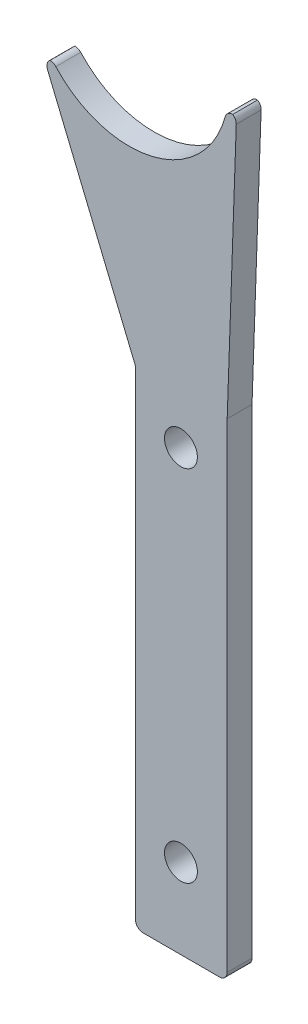
ISO-10303-21;
HEADER;
FILE_DESCRIPTION(('STEP AP214'),'2;1');
FILE_NAME('part.step','',(''),(''),'','','');
FILE_SCHEMA(('AUTOMOTIVE_DESIGN { 1 0 10303 214 1 1 1 1 }'));
ENDSEC;
DATA;
#1=APPLICATION_CONTEXT('core data for automotive mechanical design processes');
#2=APPLICATION_PROTOCOL_DEFINITION('international standard','automotive_design',2000,#1);
#3=PRODUCT_CONTEXT('',#1,'mechanical');
#4=PRODUCT('Part','Part','',(#3));
#5=PRODUCT_RELATED_PRODUCT_CATEGORY('part','',(#4));
#6=PRODUCT_DEFINITION_FORMATION('','',#4);
#7=PRODUCT_DEFINITION_CONTEXT('part definition',#1,'design');
#8=PRODUCT_DEFINITION('design','',#6,#7);
#9=PRODUCT_DEFINITION_SHAPE('','',#8);
#10=(LENGTH_UNIT() NAMED_UNIT(*) SI_UNIT(.MILLI.,.METRE.));
#11=(NAMED_UNIT(*) PLANE_ANGLE_UNIT() SI_UNIT($,.RADIAN.));
#12=(NAMED_UNIT(*) SI_UNIT($,.STERADIAN.) SOLID_ANGLE_UNIT());
#13=UNCERTAINTY_MEASURE_WITH_UNIT(LENGTH_MEASURE(1.E-05),#10,'distance_accuracy_value','');
#14=(GEOMETRIC_REPRESENTATION_CONTEXT(3) GLOBAL_UNCERTAINTY_ASSIGNED_CONTEXT((#13)) GLOBAL_UNIT_ASSIGNED_CONTEXT((#10,
#11,#12)) REPRESENTATION_CONTEXT('',''));
#15=CARTESIAN_POINT('',(0.,0.,0.));
#16=DIRECTION('',(0.,0.,1.));
#17=DIRECTION('',(1.,0.,0.));
#18=AXIS2_PLACEMENT_3D('',#15,#16,#17);
#19=CARTESIAN_POINT('',(-2.31809230427608,169.560413662932,3.175));
#20=DIRECTION('',(0.,0.,1.));
#21=DIRECTION('',(1.,0.,0.));
#22=AXIS2_PLACEMENT_3D('',#19,#20,#21);
#23=PLANE('',#22);
#24=CARTESIAN_POINT('',(4.2926,126.820276742996,3.175));
#25=DIRECTION('',(0.,0.,1.));
#26=DIRECTION('',(1.,0.,0.));
#27=AXIS2_PLACEMENT_3D('',#24,#25,#26);
#28=CIRCLE('',#27,2.1);
#29=CARTESIAN_POINT('',(6.3926,126.820276742996,3.175));
#30=VERTEX_POINT('',#29);
#31=EDGE_CURVE('E173',#30,#30,#28,.T.);
#32=ORIENTED_EDGE('',*,*,#31,.F.);
#33=EDGE_LOOP('',(#32));
#34=FACE_BOUND('',#33,.T.);
#35=CARTESIAN_POINT('',(-12.4275935947524,160.314442450676,3.175));
#36=DIRECTION('',(0.,0.,1.));
#37=DIRECTION('',(1.,0.,0.));
#38=AXIS2_PLACEMENT_3D('',#35,#36,#37);
#39=CIRCLE('',#38,1.);
#40=CARTESIAN_POINT('',(-11.6896737925278,160.98933086033,3.175));
#41=VERTEX_POINT('',#40);
#42=CARTESIAN_POINT('',(-12.4275935947524,161.314442450676,3.175));
#43=VERTEX_POINT('',#42);
#44=EDGE_CURVE('E212',#41,#43,#39,.T.);
#45=ORIENTED_EDGE('',*,*,#44,.T.);
#46=CARTESIAN_POINT('',(-11.8324325455983,160.510836001243,3.175));
#47=DIRECTION('',(0.,0.,1.));
#48=DIRECTION('',(1.,0.,0.));
#49=AXIS2_PLACEMENT_3D('',#46,#47,#48);
#50=CIRCLE('',#49,1.);
#51=CARTESIAN_POINT('',(-12.7565095548716,160.128629668313,3.175));
#52=VERTEX_POINT('',#51);
#53=EDGE_CURVE('E52',#43,#52,#50,.T.);
#54=ORIENTED_EDGE('',*,*,#53,.T.);
#55=DIRECTION('',(0.382206332930912,-0.92407700927331,0.));
#56=VECTOR('',#55,1.);
#57=CARTESIAN_POINT('',(-13.2469720926704,161.314442450676,3.175));
#58=LINE('',#57,#56);
#59=CARTESIAN_POINT('',(-1.59992299072669,133.154861162605,3.175));
#60=VERTEX_POINT('',#59);
#61=EDGE_CURVE('E189',#52,#60,#58,.T.);
#62=ORIENTED_EDGE('',*,*,#61,.T.);
#63=CARTESIAN_POINT('',(-2.524,132.772654829674,3.175));
#64=DIRECTION('',(0.,0.,1.));
#65=DIRECTION('',(1.,0.,0.));
#66=AXIS2_PLACEMENT_3D('',#63,#64,#65);
#67=CIRCLE('',#66,1.);
#68=CARTESIAN_POINT('',(-1.524,132.772654829674,3.175));
#69=VERTEX_POINT('',#68);
#70=EDGE_CURVE('E253',#60,#69,#67,.F.);
#71=ORIENTED_EDGE('',*,*,#70,.T.);
#72=DIRECTION('',(0.,-1.,0.));
#73=VECTOR('',#72,1.);
#74=CARTESIAN_POINT('',(-1.524,70.7142705310452,3.175));
#75=LINE('',#74,#73);
#76=CARTESIAN_POINT('',(-1.524,71.7142705310452,3.175));
#77=VERTEX_POINT('',#76);
#78=EDGE_CURVE('E280',#69,#77,#75,.T.);
#79=ORIENTED_EDGE('',*,*,#78,.T.);
#80=CARTESIAN_POINT('',(-0.524,71.7142705310452,3.175));
#81=DIRECTION('',(0.,0.,1.));
#82=DIRECTION('',(1.,0.,0.));
#83=AXIS2_PLACEMENT_3D('',#80,#81,#82);
#84=CIRCLE('',#83,1.);
#85=CARTESIAN_POINT('',(-0.524,70.7142705310452,3.175));
#86=VERTEX_POINT('',#85);
#87=EDGE_CURVE('E218',#77,#86,#84,.T.);
#88=ORIENTED_EDGE('',*,*,#87,.T.);
#89=DIRECTION('',(1.,0.,0.));
#90=VECTOR('',#89,1.);
#91=CARTESIAN_POINT('',(7.55374445081113,70.7142705310452,3.175));
#92=LINE('',#91,#90);
#93=CARTESIAN_POINT('',(9.2026,70.7142705310452,3.175));
#94=VERTEX_POINT('',#93);
#95=EDGE_CURVE('E150',#86,#94,#92,.T.);
#96=ORIENTED_EDGE('',*,*,#95,.T.);
#97=CARTESIAN_POINT('',(9.2026,71.7142705310452,3.175));
#98=DIRECTION('',(0.,0.,1.));
#99=DIRECTION('',(1.,0.,0.));
#100=AXIS2_PLACEMENT_3D('',#97,#98,#99);
#101=CIRCLE('',#100,1.);
#102=CARTESIAN_POINT('',(10.2026,71.7142705310452,3.175));
#103=VERTEX_POINT('',#102);
#104=EDGE_CURVE('E145',#94,#103,#101,.T.);
#105=ORIENTED_EDGE('',*,*,#104,.T.);
#106=DIRECTION('',(0.,1.,0.));
#107=VECTOR('',#106,1.);
#108=CARTESIAN_POINT('',(10.2026,70.7142705310452,3.175));
#109=LINE('',#108,#107);
#110=CARTESIAN_POINT('',(10.2026,132.97129881902,3.175));
#111=VERTEX_POINT('',#110);
#112=EDGE_CURVE('E138',#103,#111,#109,.T.);
#113=ORIENTED_EDGE('',*,*,#112,.T.);
#114=DIRECTION('',(0.0349394291623043,0.999389431748111,0.));
#115=VECTOR('',#114,1.);
#116=CARTESIAN_POINT('',(11.3925030989291,167.006674049394,3.175));
#117=LINE('',#116,#115);
#118=CARTESIAN_POINT('',(11.3620897321167,166.136745773375,3.175));
#119=VERTEX_POINT('',#118);
#120=EDGE_CURVE('E141',#111,#119,#117,.T.);
#121=ORIENTED_EDGE('',*,*,#120,.T.);
#122=CARTESIAN_POINT('',(10.3627003003685,166.171685202537,3.175));
#123=DIRECTION('',(0.,0.,1.));
#124=DIRECTION('',(1.,0.,0.));
#125=AXIS2_PLACEMENT_3D('',#122,#123,#124);
#126=CIRCLE('',#125,1.);
#127=CARTESIAN_POINT('',(10.9129671680102,167.006674049394,3.175));
#128=VERTEX_POINT('',#127);
#129=EDGE_CURVE('E265',#119,#128,#126,.T.);
#130=ORIENTED_EDGE('',*,*,#129,.T.);
#131=CARTESIAN_POINT('',(10.9129671680102,166.006674049394,3.175));
#132=DIRECTION('',(0.,0.,1.));
#133=DIRECTION('',(1.,0.,0.));
#134=AXIS2_PLACEMENT_3D('',#131,#132,#133);
#135=CIRCLE('',#134,1.);
#136=CARTESIAN_POINT('',(9.94719640360974,166.266071101477,3.175));
#137=VERTEX_POINT('',#136);
#138=EDGE_CURVE('E215',#128,#137,#135,.T.);
#139=ORIENTED_EDGE('',*,*,#138,.T.);
#140=CARTESIAN_POINT('',(-2.31809230427608,169.560413662932,3.175));
#141=DIRECTION('',(0.,0.,-1.));
#142=DIRECTION('',(1.,0.,0.));
#143=AXIS2_PLACEMENT_3D('',#140,#141,#142);
#144=CIRCLE('',#143,12.7);
#145=EDGE_CURVE('E159',#137,#41,#144,.T.);
#146=ORIENTED_EDGE('',*,*,#145,.T.);
#147=EDGE_LOOP('',(#45,#54,#62,#71,#79,#88,#96,#105,#113,#121,#130,#139,#146));
#148=FACE_BOUND('',#147,.T.);
#149=CARTESIAN_POINT('',(4.2926,80.9517188014306,3.175));
#150=DIRECTION('',(0.,0.,1.));
#151=DIRECTION('',(1.,0.,0.));
#152=AXIS2_PLACEMENT_3D('',#149,#150,#151);
#153=CIRCLE('',#152,2.1);
#154=CARTESIAN_POINT('',(6.3926,80.9517188014306,3.175));
#155=VERTEX_POINT('',#154);
#156=EDGE_CURVE('E458',#155,#155,#153,.T.);
#157=ORIENTED_EDGE('',*,*,#156,.F.);
#158=EDGE_LOOP('',(#157));
#159=FACE_BOUND('',#158,.T.);
#160=ADVANCED_FACE('F43',(#34,#148,#159),#23,.T.);
#161=CARTESIAN_POINT('',(-2.31809230427608,169.560413662932,0.));
#162=DIRECTION('',(0.,0.,1.));
#163=DIRECTION('',(1.,0.,0.));
#164=AXIS2_PLACEMENT_3D('',#161,#162,#163);
#165=PLANE('',#164);
#166=DIRECTION('',(0.382206332930912,-0.92407700927331,0.));
#167=VECTOR('',#166,1.);
#168=CARTESIAN_POINT('',(-13.2469720926704,161.314442450676,0.));
#169=LINE('',#168,#167);
#170=CARTESIAN_POINT('',(-12.7565095548716,160.128629668313,0.));
#171=VERTEX_POINT('',#170);
#172=CARTESIAN_POINT('',(-1.59992299072669,133.154861162605,0.));
#173=VERTEX_POINT('',#172);
#174=EDGE_CURVE('E169',#171,#173,#169,.T.);
#175=ORIENTED_EDGE('',*,*,#174,.F.);
#176=CARTESIAN_POINT('',(-11.8324325455983,160.510836001243,0.));
#177=DIRECTION('',(0.,0.,1.));
#178=DIRECTION('',(1.,0.,0.));
#179=AXIS2_PLACEMENT_3D('',#176,#177,#178);
#180=CIRCLE('',#179,1.);
#181=CARTESIAN_POINT('',(-12.4275935947524,161.314442450676,0.));
#182=VERTEX_POINT('',#181);
#183=EDGE_CURVE('E262',#171,#182,#180,.F.);
#184=ORIENTED_EDGE('',*,*,#183,.T.);
#185=CARTESIAN_POINT('',(-12.4275935947524,160.314442450676,0.));
#186=DIRECTION('',(0.,0.,1.));
#187=DIRECTION('',(1.,0.,0.));
#188=AXIS2_PLACEMENT_3D('',#185,#186,#187);
#189=CIRCLE('',#188,1.);
#190=CARTESIAN_POINT('',(-11.6896737925278,160.98933086033,0.));
#191=VERTEX_POINT('',#190);
#192=EDGE_CURVE('E193',#182,#191,#189,.F.);
#193=ORIENTED_EDGE('',*,*,#192,.T.);
#194=CARTESIAN_POINT('',(-2.31809230427608,169.560413662932,0.));
#195=DIRECTION('',(0.,0.,-1.));
#196=DIRECTION('',(1.,0.,0.));
#197=AXIS2_PLACEMENT_3D('',#194,#195,#196);
#198=CIRCLE('',#197,12.7);
#199=CARTESIAN_POINT('',(9.94719640360974,166.266071101477,0.));
#200=VERTEX_POINT('',#199);
#201=EDGE_CURVE('E186',#200,#191,#198,.T.);
#202=ORIENTED_EDGE('',*,*,#201,.F.);
#203=CARTESIAN_POINT('',(10.9129671680102,166.006674049394,0.));
#204=DIRECTION('',(0.,0.,1.));
#205=DIRECTION('',(1.,0.,0.));
#206=AXIS2_PLACEMENT_3D('',#203,#204,#205);
#207=CIRCLE('',#206,1.);
#208=CARTESIAN_POINT('',(10.9129671680102,167.006674049394,0.));
#209=VERTEX_POINT('',#208);
#210=EDGE_CURVE('E196',#200,#209,#207,.F.);
#211=ORIENTED_EDGE('',*,*,#210,.T.);
#212=CARTESIAN_POINT('',(10.3627003003685,166.171685202537,0.));
#213=DIRECTION('',(0.,0.,1.));
#214=DIRECTION('',(1.,0.,0.));
#215=AXIS2_PLACEMENT_3D('',#212,#213,#214);
#216=CIRCLE('',#215,1.);
#217=CARTESIAN_POINT('',(11.3620897321167,166.136745773375,0.));
#218=VERTEX_POINT('',#217);
#219=EDGE_CURVE('E65',#209,#218,#216,.F.);
#220=ORIENTED_EDGE('',*,*,#219,.T.);
#221=DIRECTION('',(0.0349394291623043,0.999389431748111,0.));
#222=VECTOR('',#221,1.);
#223=CARTESIAN_POINT('',(11.3925030989291,167.006674049394,0.));
#224=LINE('',#223,#222);
#225=CARTESIAN_POINT('',(10.2026,132.97129881902,0.));
#226=VERTEX_POINT('',#225);
#227=EDGE_CURVE('E183',#226,#218,#224,.T.);
#228=ORIENTED_EDGE('',*,*,#227,.F.);
#229=DIRECTION('',(0.,1.,0.));
#230=VECTOR('',#229,1.);
#231=CARTESIAN_POINT('',(10.2026,70.7142705310452,0.));
#232=LINE('',#231,#230);
#233=CARTESIAN_POINT('',(10.2026,71.7142705310452,0.));
#234=VERTEX_POINT('',#233);
#235=EDGE_CURVE('E156',#234,#226,#232,.T.);
#236=ORIENTED_EDGE('',*,*,#235,.F.);
#237=CARTESIAN_POINT('',(9.2026,71.7142705310452,0.));
#238=DIRECTION('',(0.,0.,1.));
#239=DIRECTION('',(1.,0.,0.));
#240=AXIS2_PLACEMENT_3D('',#237,#238,#239);
#241=CIRCLE('',#240,1.);
#242=CARTESIAN_POINT('',(9.2026,70.7142705310452,0.));
#243=VERTEX_POINT('',#242);
#244=EDGE_CURVE('E202',#234,#243,#241,.F.);
#245=ORIENTED_EDGE('',*,*,#244,.T.);
#246=DIRECTION('',(1.,0.,0.));
#247=VECTOR('',#246,1.);
#248=CARTESIAN_POINT('',(7.55374445081113,70.7142705310452,0.));
#249=LINE('',#248,#247);
#250=CARTESIAN_POINT('',(-0.524,70.7142705310452,0.));
#251=VERTEX_POINT('',#250);
#252=EDGE_CURVE('E177',#251,#243,#249,.T.);
#253=ORIENTED_EDGE('',*,*,#252,.F.);
#254=CARTESIAN_POINT('',(-0.524,71.7142705310452,0.));
#255=DIRECTION('',(0.,0.,1.));
#256=DIRECTION('',(1.,0.,0.));
#257=AXIS2_PLACEMENT_3D('',#254,#255,#256);
#258=CIRCLE('',#257,1.);
#259=CARTESIAN_POINT('',(-1.524,71.7142705310452,0.));
#260=VERTEX_POINT('',#259);
#261=EDGE_CURVE('E199',#251,#260,#258,.F.);
#262=ORIENTED_EDGE('',*,*,#261,.T.);
#263=DIRECTION('',(0.,-1.,0.));
#264=VECTOR('',#263,1.);
#265=CARTESIAN_POINT('',(-1.524,70.7142705310452,0.));
#266=LINE('',#265,#264);
#267=CARTESIAN_POINT('',(-1.524,132.772654829674,0.));
#268=VERTEX_POINT('',#267);
#269=EDGE_CURVE('E172',#268,#260,#266,.T.);
#270=ORIENTED_EDGE('',*,*,#269,.F.);
#271=CARTESIAN_POINT('',(-2.524,132.772654829674,0.));
#272=DIRECTION('',(0.,0.,1.));
#273=DIRECTION('',(1.,0.,0.));
#274=AXIS2_PLACEMENT_3D('',#271,#272,#273);
#275=CIRCLE('',#274,1.);
#276=EDGE_CURVE('E249',#268,#173,#275,.T.);
#277=ORIENTED_EDGE('',*,*,#276,.T.);
#278=EDGE_LOOP('',(#175,#184,#193,#202,#211,#220,#228,#236,#245,#253,#262,#270,#277));
#279=FACE_BOUND('',#278,.T.);
#280=CARTESIAN_POINT('',(4.2926,126.820276742996,0.));
#281=DIRECTION('',(0.,0.,1.));
#282=DIRECTION('',(1.,0.,0.));
#283=AXIS2_PLACEMENT_3D('',#280,#281,#282);
#284=CIRCLE('',#283,2.1);
#285=CARTESIAN_POINT('',(6.3926,126.820276742996,0.));
#286=VERTEX_POINT('',#285);
#287=EDGE_CURVE('E456',#286,#286,#284,.T.);
#288=ORIENTED_EDGE('',*,*,#287,.T.);
#289=EDGE_LOOP('',(#288));
#290=FACE_BOUND('',#289,.T.);
#291=CARTESIAN_POINT('',(4.2926,80.9517188014306,0.));
#292=DIRECTION('',(0.,0.,1.));
#293=DIRECTION('',(1.,0.,0.));
#294=AXIS2_PLACEMENT_3D('',#291,#292,#293);
#295=CIRCLE('',#294,2.1);
#296=CARTESIAN_POINT('',(6.3926,80.9517188014306,0.));
#297=VERTEX_POINT('',#296);
#298=EDGE_CURVE('E464',#297,#297,#295,.T.);
#299=ORIENTED_EDGE('',*,*,#298,.T.);
#300=EDGE_LOOP('',(#299));
#301=FACE_BOUND('',#300,.T.);
#302=ADVANCED_FACE('F284',(#279,#290,#301),#165,.F.);
#303=CARTESIAN_POINT('',(-13.2469720926704,161.314442450676,3.175));
#304=DIRECTION('',(0.92407700927331,0.382206332930912,0.));
#305=DIRECTION('',(-0.382206332930912,0.92407700927331,0.));
#306=AXIS2_PLACEMENT_3D('',#303,#304,#305);
#307=PLANE('',#306);
#308=ORIENTED_EDGE('',*,*,#61,.F.);
#309=DIRECTION('',(0.,0.,-1.));
#310=VECTOR('',#309,1.);
#311=CARTESIAN_POINT('',(-12.7565095548716,160.128629668313,3.175));
#312=LINE('',#311,#310);
#313=EDGE_CURVE('E256',#52,#171,#312,.T.);
#314=ORIENTED_EDGE('',*,*,#313,.T.);
#315=ORIENTED_EDGE('',*,*,#174,.T.);
#316=DIRECTION('',(0.,0.,-1.));
#317=VECTOR('',#316,1.);
#318=CARTESIAN_POINT('',(-1.59992299072669,133.154861162605,3.175));
#319=LINE('',#318,#317);
#320=EDGE_CURVE('E230',#173,#60,#319,.F.);
#321=ORIENTED_EDGE('',*,*,#320,.T.);
#322=EDGE_LOOP('',(#308,#314,#315,#321));
#323=FACE_BOUND('',#322,.T.);
#324=ADVANCED_FACE('F275',(#323),#307,.F.);
#325=CARTESIAN_POINT('',(-1.524,70.7142705310452,3.175));
#326=DIRECTION('',(1.,0.,0.));
#327=DIRECTION('',(0.,0.,-1.));
#328=AXIS2_PLACEMENT_3D('',#325,#326,#327);
#329=PLANE('',#328);
#330=ORIENTED_EDGE('',*,*,#269,.T.);
#331=DIRECTION('',(0.,0.,-1.));
#332=VECTOR('',#331,1.);
#333=CARTESIAN_POINT('',(-1.524,71.7142705310452,3.175));
#334=LINE('',#333,#332);
#335=EDGE_CURVE('E227',#260,#77,#334,.F.);
#336=ORIENTED_EDGE('',*,*,#335,.T.);
#337=ORIENTED_EDGE('',*,*,#78,.F.);
#338=DIRECTION('',(0.,0.,-1.));
#339=VECTOR('',#338,1.);
#340=CARTESIAN_POINT('',(-1.524,132.772654829674,0.));
#341=LINE('',#340,#339);
#342=EDGE_CURVE('E223',#69,#268,#341,.T.);
#343=ORIENTED_EDGE('',*,*,#342,.T.);
#344=EDGE_LOOP('',(#330,#336,#337,#343));
#345=FACE_BOUND('',#344,.T.);
#346=ADVANCED_FACE('F324',(#345),#329,.F.);
#347=CARTESIAN_POINT('',(7.55374445081113,70.7142705310452,3.175));
#348=DIRECTION('',(0.,1.,0.));
#349=DIRECTION('',(0.,0.,1.));
#350=AXIS2_PLACEMENT_3D('',#347,#348,#349);
#351=PLANE('',#350);
#352=ORIENTED_EDGE('',*,*,#252,.T.);
#353=DIRECTION('',(0.,0.,-1.));
#354=VECTOR('',#353,1.);
#355=CARTESIAN_POINT('',(9.2026,70.7142705310452,3.175));
#356=LINE('',#355,#354);
#357=EDGE_CURVE('E209',#243,#94,#356,.F.);
#358=ORIENTED_EDGE('',*,*,#357,.T.);
#359=ORIENTED_EDGE('',*,*,#95,.F.);
#360=DIRECTION('',(0.,0.,-1.));
#361=VECTOR('',#360,1.);
#362=CARTESIAN_POINT('',(-0.524,70.7142705310452,3.175));
#363=LINE('',#362,#361);
#364=EDGE_CURVE('E205',#86,#251,#363,.T.);
#365=ORIENTED_EDGE('',*,*,#364,.T.);
#366=EDGE_LOOP('',(#352,#358,#359,#365));
#367=FACE_BOUND('',#366,.T.);
#368=ADVANCED_FACE('F321',(#367),#351,.F.);
#369=CARTESIAN_POINT('',(10.2026,70.7142705310452,3.175));
#370=DIRECTION('',(-1.,0.,0.));
#371=DIRECTION('',(0.,0.,1.));
#372=AXIS2_PLACEMENT_3D('',#369,#370,#371);
#373=PLANE('',#372);
#374=ORIENTED_EDGE('',*,*,#112,.F.);
#375=DIRECTION('',(0.,0.,-1.));
#376=VECTOR('',#375,1.);
#377=CARTESIAN_POINT('',(10.2026,71.7142705310452,3.175));
#378=LINE('',#377,#376);
#379=EDGE_CURVE('E158',#103,#234,#378,.T.);
#380=ORIENTED_EDGE('',*,*,#379,.T.);
#381=ORIENTED_EDGE('',*,*,#235,.T.);
#382=DIRECTION('',(0.,0.,-1.));
#383=VECTOR('',#382,1.);
#384=CARTESIAN_POINT('',(10.2026,132.97129881902,3.175));
#385=LINE('',#384,#383);
#386=EDGE_CURVE('E153',#111,#226,#385,.T.);
#387=ORIENTED_EDGE('',*,*,#386,.F.);
#388=EDGE_LOOP('',(#374,#380,#381,#387));
#389=FACE_BOUND('',#388,.T.);
#390=ADVANCED_FACE('F154',(#389),#373,.F.);
#391=CARTESIAN_POINT('',(11.3925030989291,167.006674049394,3.175));
#392=DIRECTION('',(-0.999389431748111,0.0349394291623043,0.));
#393=DIRECTION('',(-0.0349394291623043,-0.999389431748111,0.));
#394=AXIS2_PLACEMENT_3D('',#391,#392,#393);
#395=PLANE('',#394);
#396=ORIENTED_EDGE('',*,*,#227,.T.);
#397=DIRECTION('',(0.,0.,-1.));
#398=VECTOR('',#397,1.);
#399=CARTESIAN_POINT('',(11.3620897321167,166.136745773375,3.175));
#400=LINE('',#399,#398);
#401=EDGE_CURVE('E11',#218,#119,#400,.F.);
#402=ORIENTED_EDGE('',*,*,#401,.T.);
#403=ORIENTED_EDGE('',*,*,#120,.F.);
#404=ORIENTED_EDGE('',*,*,#386,.T.);
#405=EDGE_LOOP('',(#396,#402,#403,#404));
#406=FACE_BOUND('',#405,.T.);
#407=ADVANCED_FACE('F161',(#406),#395,.F.);
#408=CARTESIAN_POINT('',(-2.31809230427608,169.560413662932,3.175));
#409=DIRECTION('',(0.,0.,-1.));
#410=DIRECTION('',(-1.,0.,0.));
#411=AXIS2_PLACEMENT_3D('',#408,#409,#410);
#412=CYLINDRICAL_SURFACE('',#411,12.7);
#413=ORIENTED_EDGE('',*,*,#145,.F.);
#414=DIRECTION('',(0.,0.,-1.));
#415=VECTOR('',#414,1.);
#416=CARTESIAN_POINT('',(9.94719640360974,166.266071101477,3.175));
#417=LINE('',#416,#415);
#418=EDGE_CURVE('E237',#137,#200,#417,.T.);
#419=ORIENTED_EDGE('',*,*,#418,.T.);
#420=ORIENTED_EDGE('',*,*,#201,.T.);
#421=DIRECTION('',(0.,0.,-1.));
#422=VECTOR('',#421,1.);
#423=CARTESIAN_POINT('',(-11.6896737925278,160.98933086033,3.175));
#424=LINE('',#423,#422);
#425=EDGE_CURVE('E234',#191,#41,#424,.F.);
#426=ORIENTED_EDGE('',*,*,#425,.T.);
#427=EDGE_LOOP('',(#413,#419,#420,#426));
#428=FACE_BOUND('',#427,.T.);
#429=ADVANCED_FACE('F292',(#428),#412,.F.);
#430=CARTESIAN_POINT('',(4.2926,126.820276742996,3.175));
#431=DIRECTION('',(0.,0.,-1.));
#432=DIRECTION('',(-1.,0.,0.));
#433=AXIS2_PLACEMENT_3D('',#430,#431,#432);
#434=CYLINDRICAL_SURFACE('',#433,2.1);
#435=ORIENTED_EDGE('',*,*,#31,.T.);
#436=EDGE_LOOP('',(#435));
#437=FACE_BOUND('',#436,.T.);
#438=ORIENTED_EDGE('',*,*,#287,.F.);
#439=EDGE_LOOP('',(#438));
#440=FACE_BOUND('',#439,.T.);
#441=ADVANCED_FACE('F312',(#437,#440),#434,.F.);
#442=CARTESIAN_POINT('',(4.2926,80.9517188014306,3.175));
#443=DIRECTION('',(0.,0.,-1.));
#444=DIRECTION('',(-1.,0.,0.));
#445=AXIS2_PLACEMENT_3D('',#442,#443,#444);
#446=CYLINDRICAL_SURFACE('',#445,2.1);
#447=ORIENTED_EDGE('',*,*,#156,.T.);
#448=EDGE_LOOP('',(#447));
#449=FACE_BOUND('',#448,.T.);
#450=ORIENTED_EDGE('',*,*,#298,.F.);
#451=EDGE_LOOP('',(#450));
#452=FACE_BOUND('',#451,.T.);
#453=ADVANCED_FACE('F335',(#449,#452),#446,.F.);
#454=CARTESIAN_POINT('',(9.2026,71.7142705310452,3.175));
#455=DIRECTION('',(0.,0.,-1.));
#456=DIRECTION('',(-1.,0.,0.));
#457=AXIS2_PLACEMENT_3D('',#454,#455,#456);
#458=CYLINDRICAL_SURFACE('',#457,1.);
#459=ORIENTED_EDGE('',*,*,#104,.F.);
#460=ORIENTED_EDGE('',*,*,#357,.F.);
#461=ORIENTED_EDGE('',*,*,#244,.F.);
#462=ORIENTED_EDGE('',*,*,#379,.F.);
#463=EDGE_LOOP('',(#459,#460,#461,#462));
#464=FACE_BOUND('',#463,.T.);
#465=ADVANCED_FACE('F331',(#464),#458,.T.);
#466=CARTESIAN_POINT('',(-0.524,71.7142705310452,3.175));
#467=DIRECTION('',(0.,0.,-1.));
#468=DIRECTION('',(-1.,0.,0.));
#469=AXIS2_PLACEMENT_3D('',#466,#467,#468);
#470=CYLINDRICAL_SURFACE('',#469,1.);
#471=ORIENTED_EDGE('',*,*,#87,.F.);
#472=ORIENTED_EDGE('',*,*,#335,.F.);
#473=ORIENTED_EDGE('',*,*,#261,.F.);
#474=ORIENTED_EDGE('',*,*,#364,.F.);
#475=EDGE_LOOP('',(#471,#472,#473,#474));
#476=FACE_BOUND('',#475,.T.);
#477=ADVANCED_FACE('F334',(#476),#470,.T.);
#478=CARTESIAN_POINT('',(-2.524,132.772654829674,3.175));
#479=DIRECTION('',(0.,0.,1.));
#480=DIRECTION('',(1.,0.,0.));
#481=AXIS2_PLACEMENT_3D('',#478,#479,#480);
#482=CYLINDRICAL_SURFACE('',#481,1.);
#483=ORIENTED_EDGE('',*,*,#70,.F.);
#484=ORIENTED_EDGE('',*,*,#320,.F.);
#485=ORIENTED_EDGE('',*,*,#276,.F.);
#486=ORIENTED_EDGE('',*,*,#342,.F.);
#487=EDGE_LOOP('',(#483,#484,#485,#486));
#488=FACE_BOUND('',#487,.T.);
#489=ADVANCED_FACE('F339',(#488),#482,.F.);
#490=CARTESIAN_POINT('',(10.9129671680102,166.006674049394,3.175));
#491=DIRECTION('',(0.,0.,-1.));
#492=DIRECTION('',(-1.,0.,0.));
#493=AXIS2_PLACEMENT_3D('',#490,#491,#492);
#494=CYLINDRICAL_SURFACE('',#493,1.);
#495=ORIENTED_EDGE('',*,*,#138,.F.);
#496=DIRECTION('',(0.,0.,-1.));
#497=VECTOR('',#496,1.);
#498=CARTESIAN_POINT('',(10.9129671680102,167.006674049394,3.175));
#499=LINE('',#498,#497);
#500=EDGE_CURVE('E241',#209,#128,#499,.F.);
#501=ORIENTED_EDGE('',*,*,#500,.F.);
#502=ORIENTED_EDGE('',*,*,#210,.F.);
#503=ORIENTED_EDGE('',*,*,#418,.F.);
#504=EDGE_LOOP('',(#495,#501,#502,#503));
#505=FACE_BOUND('',#504,.T.);
#506=ADVANCED_FACE('F297',(#505),#494,.T.);
#507=CARTESIAN_POINT('',(-12.4275935947524,160.314442450676,3.175));
#508=DIRECTION('',(0.,0.,-1.));
#509=DIRECTION('',(-1.,0.,0.));
#510=AXIS2_PLACEMENT_3D('',#507,#508,#509);
#511=CYLINDRICAL_SURFACE('',#510,1.);
#512=ORIENTED_EDGE('',*,*,#44,.F.);
#513=ORIENTED_EDGE('',*,*,#425,.F.);
#514=ORIENTED_EDGE('',*,*,#192,.F.);
#515=DIRECTION('',(0.,0.,-1.));
#516=VECTOR('',#515,1.);
#517=CARTESIAN_POINT('',(-12.4275935947524,161.314442450676,3.175));
#518=LINE('',#517,#516);
#519=EDGE_CURVE('E245',#43,#182,#518,.T.);
#520=ORIENTED_EDGE('',*,*,#519,.F.);
#521=EDGE_LOOP('',(#512,#513,#514,#520));
#522=FACE_BOUND('',#521,.T.);
#523=ADVANCED_FACE('F289',(#522),#511,.T.);
#524=CARTESIAN_POINT('',(-11.8324325455983,160.510836001243,3.175));
#525=DIRECTION('',(0.,0.,-1.));
#526=DIRECTION('',(-1.,0.,0.));
#527=AXIS2_PLACEMENT_3D('',#524,#525,#526);
#528=CYLINDRICAL_SURFACE('',#527,1.);
#529=ORIENTED_EDGE('',*,*,#53,.F.);
#530=ORIENTED_EDGE('',*,*,#519,.T.);
#531=ORIENTED_EDGE('',*,*,#183,.F.);
#532=ORIENTED_EDGE('',*,*,#313,.F.);
#533=EDGE_LOOP('',(#529,#530,#531,#532));
#534=FACE_BOUND('',#533,.T.);
#535=ADVANCED_FACE('F282',(#534),#528,.T.);
#536=CARTESIAN_POINT('',(10.3627003003685,166.171685202537,3.175));
#537=DIRECTION('',(0.,0.,-1.));
#538=DIRECTION('',(-1.,0.,0.));
#539=AXIS2_PLACEMENT_3D('',#536,#537,#538);
#540=CYLINDRICAL_SURFACE('',#539,1.);
#541=ORIENTED_EDGE('',*,*,#129,.F.);
#542=ORIENTED_EDGE('',*,*,#401,.F.);
#543=ORIENTED_EDGE('',*,*,#219,.F.);
#544=ORIENTED_EDGE('',*,*,#500,.T.);
#545=EDGE_LOOP('',(#541,#542,#543,#544));
#546=FACE_BOUND('',#545,.T.);
#547=ADVANCED_FACE('F45',(#546),#540,.T.);
#548=CLOSED_SHELL('',(#160,#302,#324,#346,#368,#390,#407,#429,#441,#453,#465,#477,#489,#506,
#523,#535,#547));
#549=MANIFOLD_SOLID_BREP('B2',#548);
#550=ADVANCED_BREP_SHAPE_REPRESENTATION('',(#18,#549),#14);
#551=SHAPE_DEFINITION_REPRESENTATION(#9,#550);
ENDSEC;
END-ISO-10303-21;
